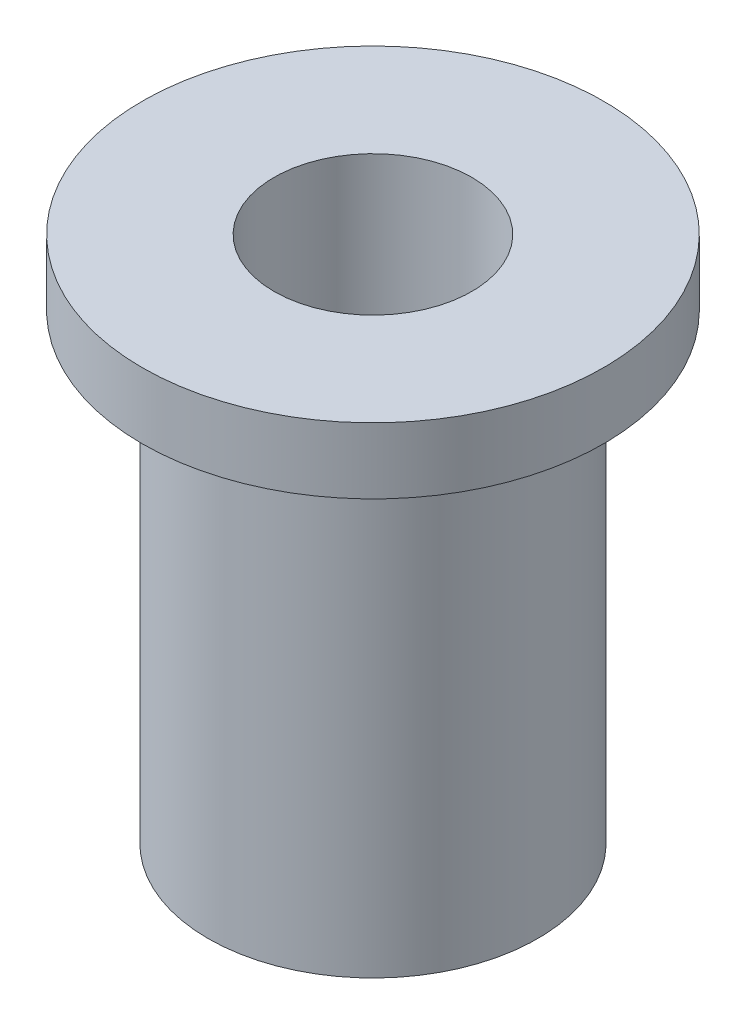
ISO-10303-21;
HEADER;
FILE_DESCRIPTION(('STEP AP214'),'2;1');
FILE_NAME('part.step','',(''),(''),'','','');
FILE_SCHEMA(('AUTOMOTIVE_DESIGN { 1 0 10303 214 1 1 1 1 }'));
ENDSEC;
DATA;
#1=APPLICATION_CONTEXT('core data for automotive mechanical design processes');
#2=APPLICATION_PROTOCOL_DEFINITION('international standard','automotive_design',2000,#1);
#3=PRODUCT_CONTEXT('',#1,'mechanical');
#4=PRODUCT('Part','Part','',(#3));
#5=PRODUCT_RELATED_PRODUCT_CATEGORY('part','',(#4));
#6=PRODUCT_DEFINITION_FORMATION('','',#4);
#7=PRODUCT_DEFINITION_CONTEXT('part definition',#1,'design');
#8=PRODUCT_DEFINITION('design','',#6,#7);
#9=PRODUCT_DEFINITION_SHAPE('','',#8);
#10=(LENGTH_UNIT() NAMED_UNIT(*) SI_UNIT(.MILLI.,.METRE.));
#11=(NAMED_UNIT(*) PLANE_ANGLE_UNIT() SI_UNIT($,.RADIAN.));
#12=(NAMED_UNIT(*) SI_UNIT($,.STERADIAN.) SOLID_ANGLE_UNIT());
#13=UNCERTAINTY_MEASURE_WITH_UNIT(LENGTH_MEASURE(1.E-05),#10,'distance_accuracy_value','');
#14=(GEOMETRIC_REPRESENTATION_CONTEXT(3) GLOBAL_UNCERTAINTY_ASSIGNED_CONTEXT((#13)) GLOBAL_UNIT_ASSIGNED_CONTEXT((#10,
#11,#12)) REPRESENTATION_CONTEXT('',''));
#15=CARTESIAN_POINT('',(0.,0.,0.));
#16=DIRECTION('',(0.,0.,1.));
#17=DIRECTION('',(1.,0.,0.));
#18=AXIS2_PLACEMENT_3D('',#15,#16,#17);
#19=CARTESIAN_POINT('',(0.,12.7,0.));
#20=DIRECTION('',(0.,-1.,0.));
#21=DIRECTION('',(0.,0.,-1.));
#22=AXIS2_PLACEMENT_3D('',#19,#20,#21);
#23=CYLINDRICAL_SURFACE('',#22,3.96875);
#24=CARTESIAN_POINT('',(0.,0.,0.));
#25=DIRECTION('',(0.,1.,0.));
#26=DIRECTION('',(0.,0.,1.));
#27=AXIS2_PLACEMENT_3D('',#24,#25,#26);
#28=CIRCLE('',#27,3.96875);
#29=CARTESIAN_POINT('',(0.,0.,3.96875));
#30=VERTEX_POINT('',#29);
#31=EDGE_CURVE('E36',#30,#30,#28,.T.);
#32=ORIENTED_EDGE('',*,*,#31,.T.);
#33=EDGE_LOOP('',(#32));
#34=FACE_BOUND('',#33,.T.);
#35=CARTESIAN_POINT('',(0.,11.1125,0.));
#36=DIRECTION('',(0.,1.,0.));
#37=DIRECTION('',(0.,0.,1.));
#38=AXIS2_PLACEMENT_3D('',#35,#36,#37);
#39=CIRCLE('',#38,3.96875);
#40=CARTESIAN_POINT('',(0.,11.1125,3.96875));
#41=VERTEX_POINT('',#40);
#42=EDGE_CURVE('E10',#41,#41,#39,.T.);
#43=ORIENTED_EDGE('',*,*,#42,.F.);
#44=EDGE_LOOP('',(#43));
#45=FACE_BOUND('',#44,.T.);
#46=ADVANCED_FACE('F33',(#34,#45),#23,.T.);
#47=CARTESIAN_POINT('',(0.,12.7,0.));
#48=DIRECTION('',(0.,1.,0.));
#49=DIRECTION('',(0.,0.,1.));
#50=AXIS2_PLACEMENT_3D('',#47,#48,#49);
#51=PLANE('',#50);
#52=CARTESIAN_POINT('',(0.,12.7,0.));
#53=DIRECTION('',(0.,1.,0.));
#54=DIRECTION('',(0.,0.,1.));
#55=AXIS2_PLACEMENT_3D('',#52,#53,#54);
#56=CIRCLE('',#55,2.38125);
#57=CARTESIAN_POINT('',(0.,12.7,2.38125));
#58=VERTEX_POINT('',#57);
#59=EDGE_CURVE('E44',#58,#58,#56,.T.);
#60=ORIENTED_EDGE('',*,*,#59,.F.);
#61=EDGE_LOOP('',(#60));
#62=FACE_BOUND('',#61,.T.);
#63=CARTESIAN_POINT('',(0.,12.7,0.));
#64=DIRECTION('',(0.,1.,0.));
#65=DIRECTION('',(0.,0.,1.));
#66=AXIS2_PLACEMENT_3D('',#63,#64,#65);
#67=CIRCLE('',#66,5.55625);
#68=CARTESIAN_POINT('',(0.,12.7,5.55625));
#69=VERTEX_POINT('',#68);
#70=EDGE_CURVE('E47',#69,#69,#67,.T.);
#71=ORIENTED_EDGE('',*,*,#70,.T.);
#72=EDGE_LOOP('',(#71));
#73=FACE_BOUND('',#72,.T.);
#74=ADVANCED_FACE('F61',(#62,#73),#51,.T.);
#75=CARTESIAN_POINT('',(0.,0.,0.));
#76=DIRECTION('',(0.,1.,0.));
#77=DIRECTION('',(0.,0.,1.));
#78=AXIS2_PLACEMENT_3D('',#75,#76,#77);
#79=PLANE('',#78);
#80=ORIENTED_EDGE('',*,*,#31,.F.);
#81=EDGE_LOOP('',(#80));
#82=FACE_BOUND('',#81,.T.);
#83=CARTESIAN_POINT('',(0.,0.,0.));
#84=DIRECTION('',(0.,1.,0.));
#85=DIRECTION('',(0.,0.,1.));
#86=AXIS2_PLACEMENT_3D('',#83,#84,#85);
#87=CIRCLE('',#86,2.38125);
#88=CARTESIAN_POINT('',(0.,0.,2.38125));
#89=VERTEX_POINT('',#88);
#90=EDGE_CURVE('E50',#89,#89,#87,.T.);
#91=ORIENTED_EDGE('',*,*,#90,.T.);
#92=EDGE_LOOP('',(#91));
#93=FACE_BOUND('',#92,.T.);
#94=ADVANCED_FACE('F79',(#82,#93),#79,.F.);
#95=CARTESIAN_POINT('',(0.,12.7,0.));
#96=DIRECTION('',(0.,-1.,0.));
#97=DIRECTION('',(0.,0.,-1.));
#98=AXIS2_PLACEMENT_3D('',#95,#96,#97);
#99=CYLINDRICAL_SURFACE('',#98,2.38125);
#100=ORIENTED_EDGE('',*,*,#59,.T.);
#101=EDGE_LOOP('',(#100));
#102=FACE_BOUND('',#101,.T.);
#103=ORIENTED_EDGE('',*,*,#90,.F.);
#104=EDGE_LOOP('',(#103));
#105=FACE_BOUND('',#104,.T.);
#106=ADVANCED_FACE('F70',(#102,#105),#99,.F.);
#107=CARTESIAN_POINT('',(0.,11.1125,0.));
#108=DIRECTION('',(0.,1.,0.));
#109=DIRECTION('',(0.,0.,1.));
#110=AXIS2_PLACEMENT_3D('',#107,#108,#109);
#111=PLANE('',#110);
#112=CARTESIAN_POINT('',(0.,11.1125,0.));
#113=DIRECTION('',(0.,1.,0.));
#114=DIRECTION('',(0.,0.,1.));
#115=AXIS2_PLACEMENT_3D('',#112,#113,#114);
#116=CIRCLE('',#115,5.55625);
#117=CARTESIAN_POINT('',(0.,11.1125,5.55625));
#118=VERTEX_POINT('',#117);
#119=EDGE_CURVE('E52',#118,#118,#116,.T.);
#120=ORIENTED_EDGE('',*,*,#119,.F.);
#121=EDGE_LOOP('',(#120));
#122=FACE_BOUND('',#121,.T.);
#123=ORIENTED_EDGE('',*,*,#42,.T.);
#124=EDGE_LOOP('',(#123));
#125=FACE_BOUND('',#124,.T.);
#126=ADVANCED_FACE('F65',(#122,#125),#111,.F.);
#127=CARTESIAN_POINT('',(0.,11.1125,0.));
#128=DIRECTION('',(0.,1.,0.));
#129=DIRECTION('',(0.,0.,1.));
#130=AXIS2_PLACEMENT_3D('',#127,#128,#129);
#131=CYLINDRICAL_SURFACE('',#130,5.55625);
#132=ORIENTED_EDGE('',*,*,#119,.T.);
#133=EDGE_LOOP('',(#132));
#134=FACE_BOUND('',#133,.T.);
#135=ORIENTED_EDGE('',*,*,#70,.F.);
#136=EDGE_LOOP('',(#135));
#137=FACE_BOUND('',#136,.T.);
#138=ADVANCED_FACE('F63',(#134,#137),#131,.T.);
#139=CLOSED_SHELL('',(#46,#74,#94,#106,#126,#138));
#140=MANIFOLD_SOLID_BREP('B2',#139);
#141=ADVANCED_BREP_SHAPE_REPRESENTATION('',(#18,#140),#14);
#142=SHAPE_DEFINITION_REPRESENTATION(#9,#141);
ENDSEC;
END-ISO-10303-21;
